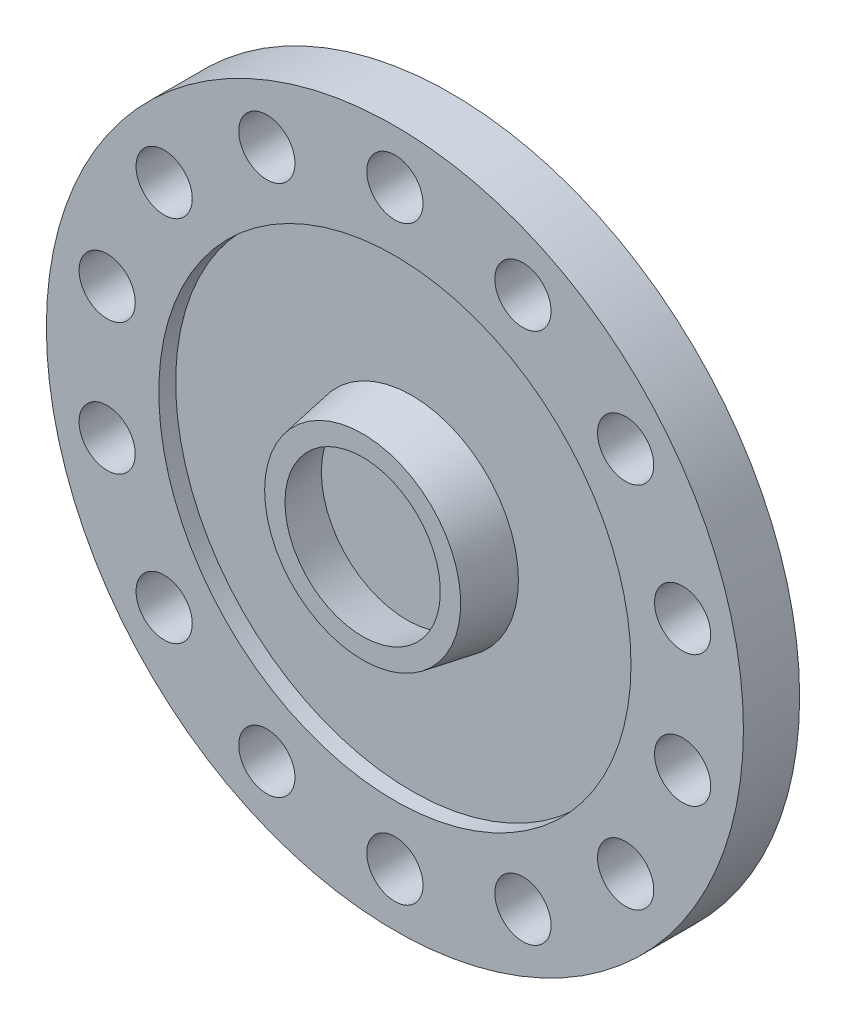
ISO-10303-21;
HEADER;
FILE_DESCRIPTION(('STEP AP214'),'2;1');
FILE_NAME('part.step','',(''),(''),'','','');
FILE_SCHEMA(('AUTOMOTIVE_DESIGN { 1 0 10303 214 1 1 1 1 }'));
ENDSEC;
DATA;
#1=APPLICATION_CONTEXT('core data for automotive mechanical design processes');
#2=APPLICATION_PROTOCOL_DEFINITION('international standard','automotive_design',2000,#1);
#3=PRODUCT_CONTEXT('',#1,'mechanical');
#4=PRODUCT('Part','Part','',(#3));
#5=PRODUCT_RELATED_PRODUCT_CATEGORY('part','',(#4));
#6=PRODUCT_DEFINITION_FORMATION('','',#4);
#7=PRODUCT_DEFINITION_CONTEXT('part definition',#1,'design');
#8=PRODUCT_DEFINITION('design','',#6,#7);
#9=PRODUCT_DEFINITION_SHAPE('','',#8);
#10=(LENGTH_UNIT() NAMED_UNIT(*) SI_UNIT(.MILLI.,.METRE.));
#11=(NAMED_UNIT(*) PLANE_ANGLE_UNIT() SI_UNIT($,.RADIAN.));
#12=(NAMED_UNIT(*) SI_UNIT($,.STERADIAN.) SOLID_ANGLE_UNIT());
#13=UNCERTAINTY_MEASURE_WITH_UNIT(LENGTH_MEASURE(1.E-05),#10,'distance_accuracy_value','');
#14=(GEOMETRIC_REPRESENTATION_CONTEXT(3) GLOBAL_UNCERTAINTY_ASSIGNED_CONTEXT((#13)) GLOBAL_UNIT_ASSIGNED_CONTEXT((#10,
#11,#12)) REPRESENTATION_CONTEXT('',''));
#15=CARTESIAN_POINT('',(0.,0.,0.));
#16=DIRECTION('',(0.,0.,1.));
#17=DIRECTION('',(1.,0.,0.));
#18=AXIS2_PLACEMENT_3D('',#15,#16,#17);
#19=CARTESIAN_POINT('',(0.,52.5,10.));
#20=DIRECTION('',(0.,0.,-1.));
#21=DIRECTION('',(-1.,0.,0.));
#22=AXIS2_PLACEMENT_3D('',#19,#20,#21);
#23=CYLINDRICAL_SURFACE('',#22,5.);
#24=CARTESIAN_POINT('',(0.,52.5,10.));
#25=DIRECTION('',(0.,0.,1.));
#26=DIRECTION('',(1.,0.,0.));
#27=AXIS2_PLACEMENT_3D('',#24,#25,#26);
#28=CIRCLE('',#27,5.);
#29=CARTESIAN_POINT('',(5.,52.5,10.));
#30=VERTEX_POINT('',#29);
#31=EDGE_CURVE('E52',#30,#30,#28,.T.);
#32=ORIENTED_EDGE('',*,*,#31,.T.);
#33=EDGE_LOOP('',(#32));
#34=FACE_BOUND('',#33,.T.);
#35=CARTESIAN_POINT('',(0.,52.5,0.));
#36=DIRECTION('',(0.,0.,1.));
#37=DIRECTION('',(1.,0.,0.));
#38=AXIS2_PLACEMENT_3D('',#35,#36,#37);
#39=CIRCLE('',#38,5.);
#40=CARTESIAN_POINT('',(5.,52.5,0.));
#41=VERTEX_POINT('',#40);
#42=EDGE_CURVE('E101',#41,#41,#39,.T.);
#43=ORIENTED_EDGE('',*,*,#42,.F.);
#44=EDGE_LOOP('',(#43));
#45=FACE_BOUND('',#44,.T.);
#46=ADVANCED_FACE('F41',(#34,#45),#23,.F.);
#47=CARTESIAN_POINT('',(22.7788963036718,47.300865564877,10.));
#48=DIRECTION('',(0.,0.,-1.));
#49=DIRECTION('',(-1.,0.,0.));
#50=AXIS2_PLACEMENT_3D('',#47,#48,#49);
#51=CYLINDRICAL_SURFACE('',#50,4.99999999999999);
#52=CARTESIAN_POINT('',(22.7788963036718,47.300865564877,10.));
#53=DIRECTION('',(0.,0.,1.));
#54=DIRECTION('',(1.,0.,0.));
#55=AXIS2_PLACEMENT_3D('',#52,#53,#54);
#56=CIRCLE('',#55,4.99999999999999);
#57=CARTESIAN_POINT('',(27.7788963036718,47.300865564877,10.));
#58=VERTEX_POINT('',#57);
#59=EDGE_CURVE('E57',#58,#58,#56,.T.);
#60=ORIENTED_EDGE('',*,*,#59,.T.);
#61=EDGE_LOOP('',(#60));
#62=FACE_BOUND('',#61,.T.);
#63=CARTESIAN_POINT('',(22.7788963036718,47.300865564877,0.));
#64=DIRECTION('',(0.,0.,1.));
#65=DIRECTION('',(1.,0.,0.));
#66=AXIS2_PLACEMENT_3D('',#63,#64,#65);
#67=CIRCLE('',#66,4.99999999999999);
#68=CARTESIAN_POINT('',(27.7788963036718,47.300865564877,0.));
#69=VERTEX_POINT('',#68);
#70=EDGE_CURVE('E98',#69,#69,#67,.T.);
#71=ORIENTED_EDGE('',*,*,#70,.F.);
#72=EDGE_LOOP('',(#71));
#73=FACE_BOUND('',#72,.T.);
#74=ADVANCED_FACE('F151',(#62,#73),#51,.F.);
#75=CARTESIAN_POINT('',(41.0461528295716,32.7332145975834,10.));
#76=DIRECTION('',(0.,0.,-1.));
#77=DIRECTION('',(-1.,0.,0.));
#78=AXIS2_PLACEMENT_3D('',#75,#76,#77);
#79=CYLINDRICAL_SURFACE('',#78,5.);
#80=CARTESIAN_POINT('',(41.0461528295716,32.7332145975834,10.));
#81=DIRECTION('',(0.,0.,1.));
#82=DIRECTION('',(1.,0.,0.));
#83=AXIS2_PLACEMENT_3D('',#80,#81,#82);
#84=CIRCLE('',#83,5.);
#85=CARTESIAN_POINT('',(46.0461528295716,32.7332145975834,10.));
#86=VERTEX_POINT('',#85);
#87=EDGE_CURVE('E146',#86,#86,#84,.T.);
#88=ORIENTED_EDGE('',*,*,#87,.T.);
#89=EDGE_LOOP('',(#88));
#90=FACE_BOUND('',#89,.T.);
#91=CARTESIAN_POINT('',(41.0461528295716,32.7332145975834,0.));
#92=DIRECTION('',(0.,0.,1.));
#93=DIRECTION('',(1.,0.,0.));
#94=AXIS2_PLACEMENT_3D('',#91,#92,#93);
#95=CIRCLE('',#94,5.);
#96=CARTESIAN_POINT('',(46.0461528295716,32.7332145975834,0.));
#97=VERTEX_POINT('',#96);
#98=EDGE_CURVE('E95',#97,#97,#95,.T.);
#99=ORIENTED_EDGE('',*,*,#98,.F.);
#100=EDGE_LOOP('',(#99));
#101=FACE_BOUND('',#100,.T.);
#102=ADVANCED_FACE('F186',(#90,#101),#79,.F.);
#103=CARTESIAN_POINT('',(51.1837153895458,11.6823490327064,10.));
#104=DIRECTION('',(0.,0.,-1.));
#105=DIRECTION('',(-1.,0.,0.));
#106=AXIS2_PLACEMENT_3D('',#103,#104,#105);
#107=CYLINDRICAL_SURFACE('',#106,5.);
#108=CARTESIAN_POINT('',(51.1837153895458,11.6823490327064,10.));
#109=DIRECTION('',(0.,0.,1.));
#110=DIRECTION('',(1.,0.,0.));
#111=AXIS2_PLACEMENT_3D('',#108,#109,#110);
#112=CIRCLE('',#111,5.);
#113=CARTESIAN_POINT('',(56.1837153895458,11.6823490327064,10.));
#114=VERTEX_POINT('',#113);
#115=EDGE_CURVE('E143',#114,#114,#112,.T.);
#116=ORIENTED_EDGE('',*,*,#115,.T.);
#117=EDGE_LOOP('',(#116));
#118=FACE_BOUND('',#117,.T.);
#119=CARTESIAN_POINT('',(51.1837153895458,11.6823490327064,0.));
#120=DIRECTION('',(0.,0.,1.));
#121=DIRECTION('',(1.,0.,0.));
#122=AXIS2_PLACEMENT_3D('',#119,#120,#121);
#123=CIRCLE('',#122,5.);
#124=CARTESIAN_POINT('',(56.1837153895458,11.6823490327064,0.));
#125=VERTEX_POINT('',#124);
#126=EDGE_CURVE('E92',#125,#125,#123,.T.);
#127=ORIENTED_EDGE('',*,*,#126,.F.);
#128=EDGE_LOOP('',(#127));
#129=FACE_BOUND('',#128,.T.);
#130=ADVANCED_FACE('F189',(#118,#129),#107,.F.);
#131=CARTESIAN_POINT('',(51.1837153895457,-11.6823490327067,10.));
#132=DIRECTION('',(0.,0.,-1.));
#133=DIRECTION('',(-1.,0.,0.));
#134=AXIS2_PLACEMENT_3D('',#131,#132,#133);
#135=CYLINDRICAL_SURFACE('',#134,5.);
#136=CARTESIAN_POINT('',(51.1837153895457,-11.6823490327067,10.));
#137=DIRECTION('',(0.,0.,1.));
#138=DIRECTION('',(1.,0.,0.));
#139=AXIS2_PLACEMENT_3D('',#136,#137,#138);
#140=CIRCLE('',#139,5.);
#141=CARTESIAN_POINT('',(56.1837153895457,-11.6823490327067,10.));
#142=VERTEX_POINT('',#141);
#143=EDGE_CURVE('E140',#142,#142,#140,.T.);
#144=ORIENTED_EDGE('',*,*,#143,.T.);
#145=EDGE_LOOP('',(#144));
#146=FACE_BOUND('',#145,.T.);
#147=CARTESIAN_POINT('',(51.1837153895457,-11.6823490327067,0.));
#148=DIRECTION('',(0.,0.,1.));
#149=DIRECTION('',(1.,0.,0.));
#150=AXIS2_PLACEMENT_3D('',#147,#148,#149);
#151=CIRCLE('',#150,5.);
#152=CARTESIAN_POINT('',(56.1837153895457,-11.6823490327067,0.));
#153=VERTEX_POINT('',#152);
#154=EDGE_CURVE('E89',#153,#153,#151,.T.);
#155=ORIENTED_EDGE('',*,*,#154,.F.);
#156=EDGE_LOOP('',(#155));
#157=FACE_BOUND('',#156,.T.);
#158=ADVANCED_FACE('F193',(#146,#157),#135,.F.);
#159=CARTESIAN_POINT('',(41.0461528295714,-32.7332145975837,10.));
#160=DIRECTION('',(0.,0.,-1.));
#161=DIRECTION('',(-1.,0.,0.));
#162=AXIS2_PLACEMENT_3D('',#159,#160,#161);
#163=CYLINDRICAL_SURFACE('',#162,5.);
#164=CARTESIAN_POINT('',(41.0461528295714,-32.7332145975837,10.));
#165=DIRECTION('',(0.,0.,1.));
#166=DIRECTION('',(1.,0.,0.));
#167=AXIS2_PLACEMENT_3D('',#164,#165,#166);
#168=CIRCLE('',#167,5.);
#169=CARTESIAN_POINT('',(46.0461528295714,-32.7332145975837,10.));
#170=VERTEX_POINT('',#169);
#171=EDGE_CURVE('E137',#170,#170,#168,.T.);
#172=ORIENTED_EDGE('',*,*,#171,.T.);
#173=EDGE_LOOP('',(#172));
#174=FACE_BOUND('',#173,.T.);
#175=CARTESIAN_POINT('',(41.0461528295714,-32.7332145975837,0.));
#176=DIRECTION('',(0.,0.,1.));
#177=DIRECTION('',(1.,0.,0.));
#178=AXIS2_PLACEMENT_3D('',#175,#176,#177);
#179=CIRCLE('',#178,5.);
#180=CARTESIAN_POINT('',(46.0461528295714,-32.7332145975837,0.));
#181=VERTEX_POINT('',#180);
#182=EDGE_CURVE('E86',#181,#181,#179,.T.);
#183=ORIENTED_EDGE('',*,*,#182,.F.);
#184=EDGE_LOOP('',(#183));
#185=FACE_BOUND('',#184,.T.);
#186=ADVANCED_FACE('F197',(#174,#185),#163,.F.);
#187=CARTESIAN_POINT('',(22.7788963036715,-47.3008655648771,10.));
#188=DIRECTION('',(0.,0.,-1.));
#189=DIRECTION('',(-1.,0.,0.));
#190=AXIS2_PLACEMENT_3D('',#187,#188,#189);
#191=CYLINDRICAL_SURFACE('',#190,5.);
#192=CARTESIAN_POINT('',(22.7788963036715,-47.3008655648771,10.));
#193=DIRECTION('',(0.,0.,1.));
#194=DIRECTION('',(1.,0.,0.));
#195=AXIS2_PLACEMENT_3D('',#192,#193,#194);
#196=CIRCLE('',#195,5.);
#197=CARTESIAN_POINT('',(27.7788963036715,-47.3008655648771,10.));
#198=VERTEX_POINT('',#197);
#199=EDGE_CURVE('E134',#198,#198,#196,.T.);
#200=ORIENTED_EDGE('',*,*,#199,.T.);
#201=EDGE_LOOP('',(#200));
#202=FACE_BOUND('',#201,.T.);
#203=CARTESIAN_POINT('',(22.7788963036715,-47.3008655648771,0.));
#204=DIRECTION('',(0.,0.,1.));
#205=DIRECTION('',(1.,0.,0.));
#206=AXIS2_PLACEMENT_3D('',#203,#204,#205);
#207=CIRCLE('',#206,5.);
#208=CARTESIAN_POINT('',(27.7788963036715,-47.3008655648771,0.));
#209=VERTEX_POINT('',#208);
#210=EDGE_CURVE('E83',#209,#209,#207,.T.);
#211=ORIENTED_EDGE('',*,*,#210,.F.);
#212=EDGE_LOOP('',(#211));
#213=FACE_BOUND('',#212,.T.);
#214=ADVANCED_FACE('F201',(#202,#213),#191,.F.);
#215=CARTESIAN_POINT('',(-3.66605540578529E-13,-52.5,10.));
#216=DIRECTION('',(0.,0.,-1.));
#217=DIRECTION('',(-1.,0.,0.));
#218=AXIS2_PLACEMENT_3D('',#215,#216,#217);
#219=CYLINDRICAL_SURFACE('',#218,5.);
#220=CARTESIAN_POINT('',(-3.66605540578529E-13,-52.5,10.));
#221=DIRECTION('',(0.,0.,1.));
#222=DIRECTION('',(1.,0.,0.));
#223=AXIS2_PLACEMENT_3D('',#220,#221,#222);
#224=CIRCLE('',#223,5.);
#225=CARTESIAN_POINT('',(4.99999999999963,-52.5,10.));
#226=VERTEX_POINT('',#225);
#227=EDGE_CURVE('E131',#226,#226,#224,.T.);
#228=ORIENTED_EDGE('',*,*,#227,.T.);
#229=EDGE_LOOP('',(#228));
#230=FACE_BOUND('',#229,.T.);
#231=CARTESIAN_POINT('',(-3.66605540578529E-13,-52.5,0.));
#232=DIRECTION('',(0.,0.,1.));
#233=DIRECTION('',(1.,0.,0.));
#234=AXIS2_PLACEMENT_3D('',#231,#232,#233);
#235=CIRCLE('',#234,5.);
#236=CARTESIAN_POINT('',(4.99999999999963,-52.5,0.));
#237=VERTEX_POINT('',#236);
#238=EDGE_CURVE('E80',#237,#237,#235,.T.);
#239=ORIENTED_EDGE('',*,*,#238,.F.);
#240=EDGE_LOOP('',(#239));
#241=FACE_BOUND('',#240,.T.);
#242=ADVANCED_FACE('F205',(#230,#241),#219,.F.);
#243=CARTESIAN_POINT('',(-22.7788963036722,-47.3008655648768,10.));
#244=DIRECTION('',(0.,0.,-1.));
#245=DIRECTION('',(-1.,0.,0.));
#246=AXIS2_PLACEMENT_3D('',#243,#244,#245);
#247=CYLINDRICAL_SURFACE('',#246,5.);
#248=CARTESIAN_POINT('',(-22.7788963036722,-47.3008655648768,10.));
#249=DIRECTION('',(0.,0.,1.));
#250=DIRECTION('',(1.,0.,0.));
#251=AXIS2_PLACEMENT_3D('',#248,#249,#250);
#252=CIRCLE('',#251,5.);
#253=CARTESIAN_POINT('',(-17.7788963036722,-47.3008655648768,10.));
#254=VERTEX_POINT('',#253);
#255=EDGE_CURVE('E128',#254,#254,#252,.T.);
#256=ORIENTED_EDGE('',*,*,#255,.T.);
#257=EDGE_LOOP('',(#256));
#258=FACE_BOUND('',#257,.T.);
#259=CARTESIAN_POINT('',(-22.7788963036722,-47.3008655648768,0.));
#260=DIRECTION('',(0.,0.,1.));
#261=DIRECTION('',(1.,0.,0.));
#262=AXIS2_PLACEMENT_3D('',#259,#260,#261);
#263=CIRCLE('',#262,5.);
#264=CARTESIAN_POINT('',(-17.7788963036722,-47.3008655648768,0.));
#265=VERTEX_POINT('',#264);
#266=EDGE_CURVE('E77',#265,#265,#263,.T.);
#267=ORIENTED_EDGE('',*,*,#266,.F.);
#268=EDGE_LOOP('',(#267));
#269=FACE_BOUND('',#268,.T.);
#270=ADVANCED_FACE('F209',(#258,#269),#247,.F.);
#271=CARTESIAN_POINT('',(-41.0461528295719,-32.7332145975832,10.));
#272=DIRECTION('',(0.,0.,-1.));
#273=DIRECTION('',(-1.,0.,0.));
#274=AXIS2_PLACEMENT_3D('',#271,#272,#273);
#275=CYLINDRICAL_SURFACE('',#274,4.99999999999999);
#276=CARTESIAN_POINT('',(-41.0461528295719,-32.7332145975832,10.));
#277=DIRECTION('',(0.,0.,1.));
#278=DIRECTION('',(1.,0.,0.));
#279=AXIS2_PLACEMENT_3D('',#276,#277,#278);
#280=CIRCLE('',#279,4.99999999999999);
#281=CARTESIAN_POINT('',(-36.0461528295719,-32.7332145975832,10.));
#282=VERTEX_POINT('',#281);
#283=EDGE_CURVE('E125',#282,#282,#280,.T.);
#284=ORIENTED_EDGE('',*,*,#283,.T.);
#285=EDGE_LOOP('',(#284));
#286=FACE_BOUND('',#285,.T.);
#287=CARTESIAN_POINT('',(-41.0461528295719,-32.7332145975832,0.));
#288=DIRECTION('',(0.,0.,1.));
#289=DIRECTION('',(1.,0.,0.));
#290=AXIS2_PLACEMENT_3D('',#287,#288,#289);
#291=CIRCLE('',#290,4.99999999999999);
#292=CARTESIAN_POINT('',(-36.0461528295719,-32.7332145975832,0.));
#293=VERTEX_POINT('',#292);
#294=EDGE_CURVE('E74',#293,#293,#291,.T.);
#295=ORIENTED_EDGE('',*,*,#294,.F.);
#296=EDGE_LOOP('',(#295));
#297=FACE_BOUND('',#296,.T.);
#298=ADVANCED_FACE('F213',(#286,#297),#275,.F.);
#299=CARTESIAN_POINT('',(-51.1837153895459,-11.682349032706,10.));
#300=DIRECTION('',(0.,0.,-1.));
#301=DIRECTION('',(-1.,0.,0.));
#302=AXIS2_PLACEMENT_3D('',#299,#300,#301);
#303=CYLINDRICAL_SURFACE('',#302,4.99999999999999);
#304=CARTESIAN_POINT('',(-51.1837153895459,-11.682349032706,10.));
#305=DIRECTION('',(0.,0.,1.));
#306=DIRECTION('',(1.,0.,0.));
#307=AXIS2_PLACEMENT_3D('',#304,#305,#306);
#308=CIRCLE('',#307,4.99999999999999);
#309=CARTESIAN_POINT('',(-46.1837153895459,-11.682349032706,10.));
#310=VERTEX_POINT('',#309);
#311=EDGE_CURVE('E122',#310,#310,#308,.T.);
#312=ORIENTED_EDGE('',*,*,#311,.T.);
#313=EDGE_LOOP('',(#312));
#314=FACE_BOUND('',#313,.T.);
#315=CARTESIAN_POINT('',(-51.1837153895459,-11.682349032706,0.));
#316=DIRECTION('',(0.,0.,1.));
#317=DIRECTION('',(1.,0.,0.));
#318=AXIS2_PLACEMENT_3D('',#315,#316,#317);
#319=CIRCLE('',#318,4.99999999999999);
#320=CARTESIAN_POINT('',(-46.1837153895459,-11.682349032706,0.));
#321=VERTEX_POINT('',#320);
#322=EDGE_CURVE('E71',#321,#321,#319,.T.);
#323=ORIENTED_EDGE('',*,*,#322,.F.);
#324=EDGE_LOOP('',(#323));
#325=FACE_BOUND('',#324,.T.);
#326=ADVANCED_FACE('F217',(#314,#325),#303,.F.);
#327=CARTESIAN_POINT('',(-51.1837153895456,11.682349032707,10.));
#328=DIRECTION('',(0.,0.,-1.));
#329=DIRECTION('',(-1.,0.,0.));
#330=AXIS2_PLACEMENT_3D('',#327,#328,#329);
#331=CYLINDRICAL_SURFACE('',#330,5.);
#332=CARTESIAN_POINT('',(-51.1837153895456,11.682349032707,10.));
#333=DIRECTION('',(0.,0.,1.));
#334=DIRECTION('',(1.,0.,0.));
#335=AXIS2_PLACEMENT_3D('',#332,#333,#334);
#336=CIRCLE('',#335,5.);
#337=CARTESIAN_POINT('',(-46.1837153895456,11.682349032707,10.));
#338=VERTEX_POINT('',#337);
#339=EDGE_CURVE('E114',#338,#338,#336,.T.);
#340=ORIENTED_EDGE('',*,*,#339,.T.);
#341=EDGE_LOOP('',(#340));
#342=FACE_BOUND('',#341,.T.);
#343=CARTESIAN_POINT('',(-51.1837153895456,11.682349032707,0.));
#344=DIRECTION('',(0.,0.,1.));
#345=DIRECTION('',(1.,0.,0.));
#346=AXIS2_PLACEMENT_3D('',#343,#344,#345);
#347=CIRCLE('',#346,5.);
#348=CARTESIAN_POINT('',(-46.1837153895456,11.682349032707,0.));
#349=VERTEX_POINT('',#348);
#350=EDGE_CURVE('E68',#349,#349,#347,.T.);
#351=ORIENTED_EDGE('',*,*,#350,.F.);
#352=EDGE_LOOP('',(#351));
#353=FACE_BOUND('',#352,.T.);
#354=ADVANCED_FACE('F221',(#342,#353),#331,.F.);
#355=CARTESIAN_POINT('',(-41.0461528295712,32.733214597584,10.));
#356=DIRECTION('',(0.,0.,-1.));
#357=DIRECTION('',(-1.,0.,0.));
#358=AXIS2_PLACEMENT_3D('',#355,#356,#357);
#359=CYLINDRICAL_SURFACE('',#358,4.99999999999999);
#360=CARTESIAN_POINT('',(-41.0461528295712,32.733214597584,10.));
#361=DIRECTION('',(0.,0.,1.));
#362=DIRECTION('',(1.,0.,0.));
#363=AXIS2_PLACEMENT_3D('',#360,#361,#362);
#364=CIRCLE('',#363,4.99999999999999);
#365=CARTESIAN_POINT('',(-36.0461528295712,32.733214597584,10.));
#366=VERTEX_POINT('',#365);
#367=EDGE_CURVE('E109',#366,#366,#364,.T.);
#368=ORIENTED_EDGE('',*,*,#367,.T.);
#369=EDGE_LOOP('',(#368));
#370=FACE_BOUND('',#369,.T.);
#371=CARTESIAN_POINT('',(-41.0461528295712,32.733214597584,0.));
#372=DIRECTION('',(0.,0.,1.));
#373=DIRECTION('',(1.,0.,0.));
#374=AXIS2_PLACEMENT_3D('',#371,#372,#373);
#375=CIRCLE('',#374,4.99999999999999);
#376=CARTESIAN_POINT('',(-36.0461528295712,32.733214597584,0.));
#377=VERTEX_POINT('',#376);
#378=EDGE_CURVE('E64',#377,#377,#375,.T.);
#379=ORIENTED_EDGE('',*,*,#378,.F.);
#380=EDGE_LOOP('',(#379));
#381=FACE_BOUND('',#380,.T.);
#382=ADVANCED_FACE('F224',(#370,#381),#359,.F.);
#383=CARTESIAN_POINT('',(-22.7788963036712,47.3008655648773,10.));
#384=DIRECTION('',(0.,0.,-1.));
#385=DIRECTION('',(-1.,0.,0.));
#386=AXIS2_PLACEMENT_3D('',#383,#384,#385);
#387=CYLINDRICAL_SURFACE('',#386,5.);
#388=CARTESIAN_POINT('',(-22.7788963036712,47.3008655648773,10.));
#389=DIRECTION('',(0.,0.,1.));
#390=DIRECTION('',(1.,0.,0.));
#391=AXIS2_PLACEMENT_3D('',#388,#389,#390);
#392=CIRCLE('',#391,5.);
#393=CARTESIAN_POINT('',(-17.7788963036712,47.3008655648773,10.));
#394=VERTEX_POINT('',#393);
#395=EDGE_CURVE('E105',#394,#394,#392,.T.);
#396=ORIENTED_EDGE('',*,*,#395,.T.);
#397=EDGE_LOOP('',(#396));
#398=FACE_BOUND('',#397,.T.);
#399=CARTESIAN_POINT('',(-22.7788963036712,47.3008655648773,0.));
#400=DIRECTION('',(0.,0.,1.));
#401=DIRECTION('',(1.,0.,0.));
#402=AXIS2_PLACEMENT_3D('',#399,#400,#401);
#403=CIRCLE('',#402,5.);
#404=CARTESIAN_POINT('',(-17.7788963036712,47.3008655648773,0.));
#405=VERTEX_POINT('',#404);
#406=EDGE_CURVE('E61',#405,#405,#403,.T.);
#407=ORIENTED_EDGE('',*,*,#406,.F.);
#408=EDGE_LOOP('',(#407));
#409=FACE_BOUND('',#408,.T.);
#410=ADVANCED_FACE('F43',(#398,#409),#387,.F.);
#411=CARTESIAN_POINT('',(0.,0.,10.));
#412=DIRECTION('',(0.,0.,-1.));
#413=DIRECTION('',(-1.,0.,0.));
#414=AXIS2_PLACEMENT_3D('',#411,#412,#413);
#415=CYLINDRICAL_SURFACE('',#414,62.);
#416=CARTESIAN_POINT('',(0.,0.,10.));
#417=DIRECTION('',(0.,0.,1.));
#418=DIRECTION('',(1.,0.,0.));
#419=AXIS2_PLACEMENT_3D('',#416,#417,#418);
#420=CIRCLE('',#419,62.);
#421=CARTESIAN_POINT('',(62.,0.,10.));
#422=VERTEX_POINT('',#421);
#423=EDGE_CURVE('E48',#422,#422,#420,.T.);
#424=ORIENTED_EDGE('',*,*,#423,.F.);
#425=EDGE_LOOP('',(#424));
#426=FACE_BOUND('',#425,.T.);
#427=CARTESIAN_POINT('',(0.,0.,0.));
#428=DIRECTION('',(0.,0.,1.));
#429=DIRECTION('',(1.,0.,0.));
#430=AXIS2_PLACEMENT_3D('',#427,#428,#429);
#431=CIRCLE('',#430,62.);
#432=CARTESIAN_POINT('',(62.,0.,0.));
#433=VERTEX_POINT('',#432);
#434=EDGE_CURVE('E103',#433,#433,#431,.T.);
#435=ORIENTED_EDGE('',*,*,#434,.T.);
#436=EDGE_LOOP('',(#435));
#437=FACE_BOUND('',#436,.T.);
#438=ADVANCED_FACE('F158',(#426,#437),#415,.T.);
#439=CARTESIAN_POINT('',(0.,0.,10.));
#440=DIRECTION('',(0.,0.,1.));
#441=DIRECTION('',(1.,0.,0.));
#442=AXIS2_PLACEMENT_3D('',#439,#440,#441);
#443=PLANE('',#442);
#444=CARTESIAN_POINT('',(0.,0.,10.));
#445=DIRECTION('',(0.,0.,1.));
#446=DIRECTION('',(1.,0.,0.));
#447=AXIS2_PLACEMENT_3D('',#444,#445,#446);
#448=CIRCLE('',#447,42.);
#449=CARTESIAN_POINT('',(42.,0.,10.));
#450=VERTEX_POINT('',#449);
#451=EDGE_CURVE('E117',#450,#450,#448,.T.);
#452=ORIENTED_EDGE('',*,*,#451,.F.);
#453=EDGE_LOOP('',(#452));
#454=FACE_BOUND('',#453,.T.);
#455=ORIENTED_EDGE('',*,*,#395,.F.);
#456=EDGE_LOOP('',(#455));
#457=FACE_BOUND('',#456,.T.);
#458=ORIENTED_EDGE('',*,*,#367,.F.);
#459=EDGE_LOOP('',(#458));
#460=FACE_BOUND('',#459,.T.);
#461=ORIENTED_EDGE('',*,*,#339,.F.);
#462=EDGE_LOOP('',(#461));
#463=FACE_BOUND('',#462,.T.);
#464=ORIENTED_EDGE('',*,*,#311,.F.);
#465=EDGE_LOOP('',(#464));
#466=FACE_BOUND('',#465,.T.);
#467=ORIENTED_EDGE('',*,*,#283,.F.);
#468=EDGE_LOOP('',(#467));
#469=FACE_BOUND('',#468,.T.);
#470=ORIENTED_EDGE('',*,*,#255,.F.);
#471=EDGE_LOOP('',(#470));
#472=FACE_BOUND('',#471,.T.);
#473=ORIENTED_EDGE('',*,*,#227,.F.);
#474=EDGE_LOOP('',(#473));
#475=FACE_BOUND('',#474,.T.);
#476=ORIENTED_EDGE('',*,*,#199,.F.);
#477=EDGE_LOOP('',(#476));
#478=FACE_BOUND('',#477,.T.);
#479=ORIENTED_EDGE('',*,*,#171,.F.);
#480=EDGE_LOOP('',(#479));
#481=FACE_BOUND('',#480,.T.);
#482=ORIENTED_EDGE('',*,*,#143,.F.);
#483=EDGE_LOOP('',(#482));
#484=FACE_BOUND('',#483,.T.);
#485=ORIENTED_EDGE('',*,*,#115,.F.);
#486=EDGE_LOOP('',(#485));
#487=FACE_BOUND('',#486,.T.);
#488=ORIENTED_EDGE('',*,*,#87,.F.);
#489=EDGE_LOOP('',(#488));
#490=FACE_BOUND('',#489,.T.);
#491=ORIENTED_EDGE('',*,*,#59,.F.);
#492=EDGE_LOOP('',(#491));
#493=FACE_BOUND('',#492,.T.);
#494=ORIENTED_EDGE('',*,*,#31,.F.);
#495=EDGE_LOOP('',(#494));
#496=FACE_BOUND('',#495,.T.);
#497=ORIENTED_EDGE('',*,*,#423,.T.);
#498=EDGE_LOOP('',(#497));
#499=FACE_BOUND('',#498,.T.);
#500=ADVANCED_FACE('F154',(#454,#457,#460,#463,#466,#469,#472,#475,#478,#481,#484,#487,#490,
#493,#496,#499),#443,.T.);
#501=CARTESIAN_POINT('',(0.,0.,0.));
#502=DIRECTION('',(0.,0.,1.));
#503=DIRECTION('',(1.,0.,0.));
#504=AXIS2_PLACEMENT_3D('',#501,#502,#503);
#505=PLANE('',#504);
#506=ORIENTED_EDGE('',*,*,#406,.T.);
#507=EDGE_LOOP('',(#506));
#508=FACE_BOUND('',#507,.T.);
#509=ORIENTED_EDGE('',*,*,#378,.T.);
#510=EDGE_LOOP('',(#509));
#511=FACE_BOUND('',#510,.T.);
#512=ORIENTED_EDGE('',*,*,#350,.T.);
#513=EDGE_LOOP('',(#512));
#514=FACE_BOUND('',#513,.T.);
#515=ORIENTED_EDGE('',*,*,#322,.T.);
#516=EDGE_LOOP('',(#515));
#517=FACE_BOUND('',#516,.T.);
#518=ORIENTED_EDGE('',*,*,#294,.T.);
#519=EDGE_LOOP('',(#518));
#520=FACE_BOUND('',#519,.T.);
#521=ORIENTED_EDGE('',*,*,#266,.T.);
#522=EDGE_LOOP('',(#521));
#523=FACE_BOUND('',#522,.T.);
#524=ORIENTED_EDGE('',*,*,#238,.T.);
#525=EDGE_LOOP('',(#524));
#526=FACE_BOUND('',#525,.T.);
#527=ORIENTED_EDGE('',*,*,#210,.T.);
#528=EDGE_LOOP('',(#527));
#529=FACE_BOUND('',#528,.T.);
#530=ORIENTED_EDGE('',*,*,#182,.T.);
#531=EDGE_LOOP('',(#530));
#532=FACE_BOUND('',#531,.T.);
#533=ORIENTED_EDGE('',*,*,#154,.T.);
#534=EDGE_LOOP('',(#533));
#535=FACE_BOUND('',#534,.T.);
#536=ORIENTED_EDGE('',*,*,#126,.T.);
#537=EDGE_LOOP('',(#536));
#538=FACE_BOUND('',#537,.T.);
#539=ORIENTED_EDGE('',*,*,#98,.T.);
#540=EDGE_LOOP('',(#539));
#541=FACE_BOUND('',#540,.T.);
#542=ORIENTED_EDGE('',*,*,#70,.T.);
#543=EDGE_LOOP('',(#542));
#544=FACE_BOUND('',#543,.T.);
#545=ORIENTED_EDGE('',*,*,#42,.T.);
#546=EDGE_LOOP('',(#545));
#547=FACE_BOUND('',#546,.T.);
#548=ORIENTED_EDGE('',*,*,#434,.F.);
#549=EDGE_LOOP('',(#548));
#550=FACE_BOUND('',#549,.T.);
#551=ADVANCED_FACE('F157',(#508,#511,#514,#517,#520,#523,#526,#529,#532,#535,#538,#541,#544,
#547,#550),#505,.F.);
#552=CARTESIAN_POINT('',(0.,0.,7.));
#553=DIRECTION('',(0.,0.,1.));
#554=DIRECTION('',(1.,0.,0.));
#555=AXIS2_PLACEMENT_3D('',#552,#553,#554);
#556=CYLINDRICAL_SURFACE('',#555,42.);
#557=CARTESIAN_POINT('',(0.,0.,7.));
#558=DIRECTION('',(0.,0.,1.));
#559=DIRECTION('',(1.,0.,0.));
#560=AXIS2_PLACEMENT_3D('',#557,#558,#559);
#561=CIRCLE('',#560,42.);
#562=CARTESIAN_POINT('',(42.,0.,7.));
#563=VERTEX_POINT('',#562);
#564=EDGE_CURVE('E65',#563,#563,#561,.T.);
#565=ORIENTED_EDGE('',*,*,#564,.F.);
#566=EDGE_LOOP('',(#565));
#567=FACE_BOUND('',#566,.T.);
#568=ORIENTED_EDGE('',*,*,#451,.T.);
#569=EDGE_LOOP('',(#568));
#570=FACE_BOUND('',#569,.T.);
#571=ADVANCED_FACE('F170',(#567,#570),#556,.F.);
#572=CARTESIAN_POINT('',(0.,0.,7.));
#573=DIRECTION('',(0.,0.,1.));
#574=DIRECTION('',(1.,0.,0.));
#575=AXIS2_PLACEMENT_3D('',#572,#573,#574);
#576=PLANE('',#575);
#577=CARTESIAN_POINT('',(0.,0.,7.));
#578=DIRECTION('',(0.,0.,1.));
#579=DIRECTION('',(1.,0.,0.));
#580=AXIS2_PLACEMENT_3D('',#577,#578,#579);
#581=CIRCLE('',#580,18.9772248249136);
#582=CARTESIAN_POINT('',(18.9772248249136,0.,7.));
#583=VERTEX_POINT('',#582);
#584=EDGE_CURVE('E10',#583,#583,#581,.T.);
#585=ORIENTED_EDGE('',*,*,#584,.F.);
#586=EDGE_LOOP('',(#585));
#587=FACE_BOUND('',#586,.T.);
#588=ORIENTED_EDGE('',*,*,#564,.T.);
#589=EDGE_LOOP('',(#588));
#590=FACE_BOUND('',#589,.T.);
#591=ADVANCED_FACE('F177',(#587,#590),#576,.T.);
#592=CARTESIAN_POINT('',(0.,0.,6.87083556359394));
#593=DIRECTION('',(0.,0.,-1.));
#594=DIRECTION('',(-1.,0.,0.));
#595=AXIS2_PLACEMENT_3D('',#592,#593,#594);
#596=CONICAL_SURFACE('',#595,19.,0.17453292519943);
#597=ORIENTED_EDGE('',*,*,#584,.T.);
#598=EDGE_LOOP('',(#597));
#599=FACE_BOUND('',#598,.T.);
#600=CARTESIAN_POINT('',(0.,0.,15.7341053407038));
#601=DIRECTION('',(0.,0.,-1.));
#602=DIRECTION('',(-1.,0.,0.));
#603=AXIS2_PLACEMENT_3D('',#600,#601,#602);
#604=CIRCLE('',#603,17.4371664009977);
#605=CARTESIAN_POINT('',(-17.4371664009976,0.,15.7341053407038));
#606=VERTEX_POINT('',#605);
#607=EDGE_CURVE('E370',#606,#606,#604,.T.);
#608=ORIENTED_EDGE('',*,*,#607,.T.);
#609=EDGE_LOOP('',(#608));
#610=FACE_BOUND('',#609,.T.);
#611=ADVANCED_FACE('F322',(#599,#610),#596,.T.);
#612=CARTESIAN_POINT('',(-17.4371664009976,0.,15.7341053407038));
#613=DIRECTION('',(0.,0.,1.));
#614=DIRECTION('',(1.,0.,0.));
#615=AXIS2_PLACEMENT_3D('',#612,#613,#614);
#616=PLANE('',#615);
#617=CARTESIAN_POINT('',(0.,0.,15.7341053407038));
#618=DIRECTION('',(0.,0.,-1.));
#619=DIRECTION('',(-1.,0.,0.));
#620=AXIS2_PLACEMENT_3D('',#617,#618,#619);
#621=CIRCLE('',#620,13.8197815401194);
#622=CARTESIAN_POINT('',(-13.8197815401194,0.,15.7341053407038));
#623=VERTEX_POINT('',#622);
#624=EDGE_CURVE('E367',#623,#623,#621,.T.);
#625=ORIENTED_EDGE('',*,*,#624,.T.);
#626=EDGE_LOOP('',(#625));
#627=FACE_BOUND('',#626,.T.);
#628=ORIENTED_EDGE('',*,*,#607,.F.);
#629=EDGE_LOOP('',(#628));
#630=FACE_BOUND('',#629,.T.);
#631=ADVANCED_FACE('F332',(#627,#630),#616,.T.);
#632=CARTESIAN_POINT('',(0.,0.,15.7341053407038));
#633=DIRECTION('',(0.,0.,-1.));
#634=DIRECTION('',(-1.,0.,0.));
#635=AXIS2_PLACEMENT_3D('',#632,#633,#634);
#636=CONICAL_SURFACE('',#635,13.8197815401194,0.174532925199431);
#637=CARTESIAN_POINT('',(0.,0.,7.87083556359393));
#638=DIRECTION('',(0.,0.,-1.));
#639=DIRECTION('',(-1.,0.,0.));
#640=AXIS2_PLACEMENT_3D('',#637,#638,#639);
#641=CIRCLE('',#640,15.2062881584133);
#642=CARTESIAN_POINT('',(-15.2062881584133,0.,7.87083556359394));
#643=VERTEX_POINT('',#642);
#644=EDGE_CURVE('E366',#643,#643,#641,.T.);
#645=ORIENTED_EDGE('',*,*,#644,.T.);
#646=EDGE_LOOP('',(#645));
#647=FACE_BOUND('',#646,.T.);
#648=ORIENTED_EDGE('',*,*,#624,.F.);
#649=EDGE_LOOP('',(#648));
#650=FACE_BOUND('',#649,.T.);
#651=ADVANCED_FACE('F341',(#647,#650),#636,.F.);
#652=CARTESIAN_POINT('',(-15.2062881584133,0.,7.87083556359394));
#653=DIRECTION('',(0.,0.,1.));
#654=DIRECTION('',(1.,0.,0.));
#655=AXIS2_PLACEMENT_3D('',#652,#653,#654);
#656=PLANE('',#655);
#657=ORIENTED_EDGE('',*,*,#644,.F.);
#658=EDGE_LOOP('',(#657));
#659=FACE_BOUND('',#658,.T.);
#660=ADVANCED_FACE('F351',(#659),#656,.T.);
#661=CLOSED_SHELL('',(#46,#74,#102,#130,#158,#186,#214,#242,#270,#298,#326,#354,#382,#410,#438,
#500,#551,#571,#591,#611,#631,#651,#660));
#662=MANIFOLD_SOLID_BREP('B2',#661);
#663=ADVANCED_BREP_SHAPE_REPRESENTATION('',(#18,#662),#14);
#664=SHAPE_DEFINITION_REPRESENTATION(#9,#663);
ENDSEC;
END-ISO-10303-21;
